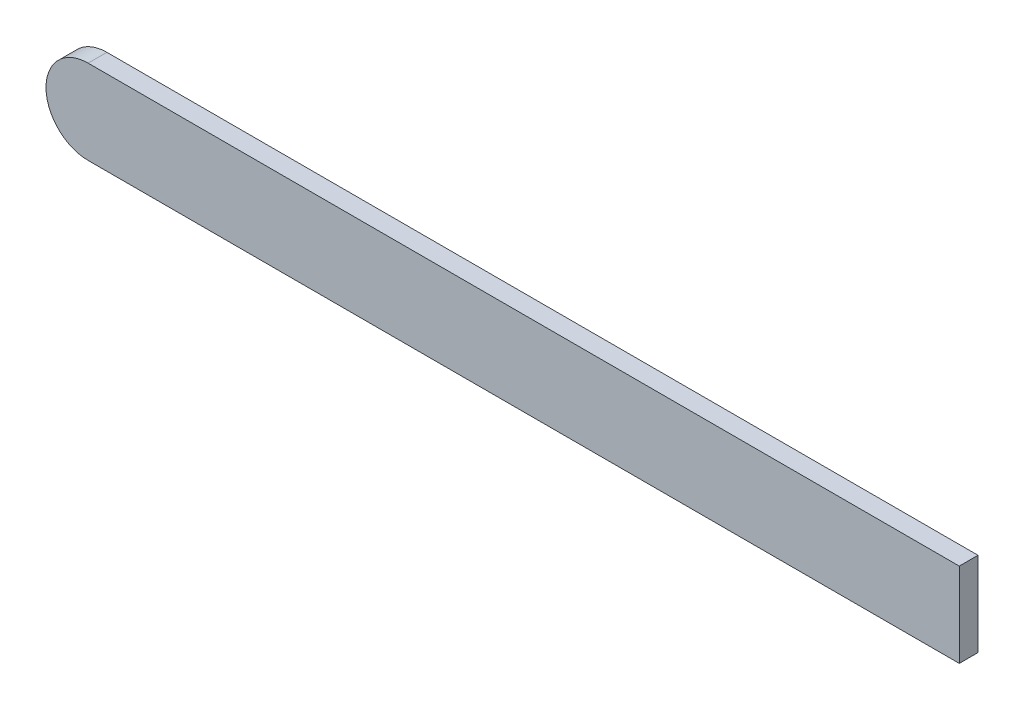
ISO-10303-21;
HEADER;
FILE_DESCRIPTION(('STEP AP214'),'2;1');
FILE_NAME('part.step','',(''),(''),'','','');
FILE_SCHEMA(('AUTOMOTIVE_DESIGN { 1 0 10303 214 1 1 1 1 }'));
ENDSEC;
DATA;
#1=APPLICATION_CONTEXT('core data for automotive mechanical design processes');
#2=APPLICATION_PROTOCOL_DEFINITION('international standard','automotive_design',2000,#1);
#3=PRODUCT_CONTEXT('',#1,'mechanical');
#4=PRODUCT('Part','Part','',(#3));
#5=PRODUCT_RELATED_PRODUCT_CATEGORY('part','',(#4));
#6=PRODUCT_DEFINITION_FORMATION('','',#4);
#7=PRODUCT_DEFINITION_CONTEXT('part definition',#1,'design');
#8=PRODUCT_DEFINITION('design','',#6,#7);
#9=PRODUCT_DEFINITION_SHAPE('','',#8);
#10=(LENGTH_UNIT() NAMED_UNIT(*) SI_UNIT(.MILLI.,.METRE.));
#11=(NAMED_UNIT(*) PLANE_ANGLE_UNIT() SI_UNIT($,.RADIAN.));
#12=(NAMED_UNIT(*) SI_UNIT($,.STERADIAN.) SOLID_ANGLE_UNIT());
#13=UNCERTAINTY_MEASURE_WITH_UNIT(LENGTH_MEASURE(1.E-05),#10,'distance_accuracy_value','');
#14=(GEOMETRIC_REPRESENTATION_CONTEXT(3) GLOBAL_UNCERTAINTY_ASSIGNED_CONTEXT((#13)) GLOBAL_UNIT_ASSIGNED_CONTEXT((#10,
#11,#12)) REPRESENTATION_CONTEXT('',''));
#15=CARTESIAN_POINT('',(0.,0.,0.));
#16=DIRECTION('',(0.,0.,1.));
#17=DIRECTION('',(1.,0.,0.));
#18=AXIS2_PLACEMENT_3D('',#15,#16,#17);
#19=CARTESIAN_POINT('',(-44.45,0.,2.11666666666582));
#20=DIRECTION('',(0.,0.,-1.));
#21=DIRECTION('',(-1.,0.,0.));
#22=AXIS2_PLACEMENT_3D('',#19,#20,#21);
#23=CYLINDRICAL_SURFACE('',#22,4.7625);
#24=CARTESIAN_POINT('',(-44.45,0.,0.));
#25=DIRECTION('',(0.,0.,1.));
#26=DIRECTION('',(1.,0.,0.));
#27=AXIS2_PLACEMENT_3D('',#24,#25,#26);
#28=CIRCLE('',#27,4.7625);
#29=CARTESIAN_POINT('',(-44.4500000000001,4.7625,0.));
#30=VERTEX_POINT('',#29);
#31=CARTESIAN_POINT('',(-44.4500000000001,-4.7625,0.));
#32=VERTEX_POINT('',#31);
#33=EDGE_CURVE('E109',#30,#32,#28,.T.);
#34=ORIENTED_EDGE('',*,*,#33,.T.);
#35=DIRECTION('',(0.,0.,-1.));
#36=VECTOR('',#35,1.);
#37=CARTESIAN_POINT('',(-44.4500000000001,-4.7625,2.11666666666582));
#38=LINE('',#37,#36);
#39=CARTESIAN_POINT('',(-44.4500000000001,-4.7625,2.11666666666582));
#40=VERTEX_POINT('',#39);
#41=EDGE_CURVE('E13',#40,#32,#38,.T.);
#42=ORIENTED_EDGE('',*,*,#41,.F.);
#43=CARTESIAN_POINT('',(-44.45,0.,2.11666666666582));
#44=DIRECTION('',(0.,0.,1.));
#45=DIRECTION('',(1.,0.,0.));
#46=AXIS2_PLACEMENT_3D('',#43,#44,#45);
#47=CIRCLE('',#46,4.7625);
#48=CARTESIAN_POINT('',(-44.4500000000001,4.76250000000001,2.11666666666585));
#49=VERTEX_POINT('',#48);
#50=EDGE_CURVE('E97',#49,#40,#47,.T.);
#51=ORIENTED_EDGE('',*,*,#50,.F.);
#52=DIRECTION('',(0.,0.,-1.));
#53=VECTOR('',#52,1.);
#54=CARTESIAN_POINT('',(-44.4500000000001,4.76250000000001,2.11666666666585));
#55=LINE('',#54,#53);
#56=EDGE_CURVE('E105',#49,#30,#55,.T.);
#57=ORIENTED_EDGE('',*,*,#56,.T.);
#58=EDGE_LOOP('',(#34,#42,#51,#57));
#59=FACE_BOUND('',#58,.T.);
#60=ADVANCED_FACE('F46',(#59),#23,.T.);
#61=CARTESIAN_POINT('',(-44.4500000000001,-4.7625,2.11666666666582));
#62=DIRECTION('',(0.,1.,0.));
#63=DIRECTION('',(0.,0.,1.));
#64=AXIS2_PLACEMENT_3D('',#61,#62,#63);
#65=PLANE('',#64);
#66=DIRECTION('',(1.,0.,0.));
#67=VECTOR('',#66,1.);
#68=CARTESIAN_POINT('',(-44.4500000000001,-4.7625,0.));
#69=LINE('',#68,#67);
#70=CARTESIAN_POINT('',(53.975,-4.76249999999999,0.));
#71=VERTEX_POINT('',#70);
#72=EDGE_CURVE('E101',#32,#71,#69,.T.);
#73=ORIENTED_EDGE('',*,*,#72,.T.);
#74=DIRECTION('',(0.,0.,-1.));
#75=VECTOR('',#74,1.);
#76=CARTESIAN_POINT('',(53.975,-4.7625,2.11666666666582));
#77=LINE('',#76,#75);
#78=CARTESIAN_POINT('',(53.975,-4.7625,2.11666666666582));
#79=VERTEX_POINT('',#78);
#80=EDGE_CURVE('E54',#79,#71,#77,.T.);
#81=ORIENTED_EDGE('',*,*,#80,.F.);
#82=DIRECTION('',(1.,0.,0.));
#83=VECTOR('',#82,1.);
#84=CARTESIAN_POINT('',(-44.4500000000001,-4.7625,2.11666666666582));
#85=LINE('',#84,#83);
#86=EDGE_CURVE('E92',#40,#79,#85,.T.);
#87=ORIENTED_EDGE('',*,*,#86,.F.);
#88=ORIENTED_EDGE('',*,*,#41,.T.);
#89=EDGE_LOOP('',(#73,#81,#87,#88));
#90=FACE_BOUND('',#89,.T.);
#91=ADVANCED_FACE('F100',(#90),#65,.F.);
#92=CARTESIAN_POINT('',(53.975,4.76250000000004,2.11666666666582));
#93=DIRECTION('',(-1.,0.,0.));
#94=DIRECTION('',(0.,0.,1.));
#95=AXIS2_PLACEMENT_3D('',#92,#93,#94);
#96=PLANE('',#95);
#97=DIRECTION('',(0.,1.,0.));
#98=VECTOR('',#97,1.);
#99=CARTESIAN_POINT('',(53.975,4.76250000000001,0.));
#100=LINE('',#99,#98);
#101=CARTESIAN_POINT('',(53.975,4.76250000000001,0.));
#102=VERTEX_POINT('',#101);
#103=EDGE_CURVE('E79',#71,#102,#100,.T.);
#104=ORIENTED_EDGE('',*,*,#103,.T.);
#105=DIRECTION('',(0.,0.,-1.));
#106=VECTOR('',#105,1.);
#107=CARTESIAN_POINT('',(53.975,4.76250000000004,2.11666666666582));
#108=LINE('',#107,#106);
#109=CARTESIAN_POINT('',(53.975,4.76250000000004,2.11666666666582));
#110=VERTEX_POINT('',#109);
#111=EDGE_CURVE('E102',#110,#102,#108,.T.);
#112=ORIENTED_EDGE('',*,*,#111,.F.);
#113=DIRECTION('',(0.,1.,0.));
#114=VECTOR('',#113,1.);
#115=CARTESIAN_POINT('',(53.975,4.76250000000004,2.11666666666582));
#116=LINE('',#115,#114);
#117=EDGE_CURVE('E95',#79,#110,#116,.T.);
#118=ORIENTED_EDGE('',*,*,#117,.F.);
#119=ORIENTED_EDGE('',*,*,#80,.T.);
#120=EDGE_LOOP('',(#104,#112,#118,#119));
#121=FACE_BOUND('',#120,.T.);
#122=ADVANCED_FACE('F103',(#121),#96,.F.);
#123=CARTESIAN_POINT('',(-44.4500000000001,4.76250000000001,2.11666666666585));
#124=DIRECTION('',(0.,-1.,0.));
#125=DIRECTION('',(0.,0.,-1.));
#126=AXIS2_PLACEMENT_3D('',#123,#124,#125);
#127=PLANE('',#126);
#128=DIRECTION('',(-1.,0.,0.));
#129=VECTOR('',#128,1.);
#130=CARTESIAN_POINT('',(-44.4500000000001,4.7625,0.));
#131=LINE('',#130,#129);
#132=EDGE_CURVE('E85',#102,#30,#131,.T.);
#133=ORIENTED_EDGE('',*,*,#132,.T.);
#134=ORIENTED_EDGE('',*,*,#56,.F.);
#135=DIRECTION('',(-1.,0.,0.));
#136=VECTOR('',#135,1.);
#137=CARTESIAN_POINT('',(-44.4500000000001,4.76250000000001,2.11666666666585));
#138=LINE('',#137,#136);
#139=EDGE_CURVE('E62',#110,#49,#138,.T.);
#140=ORIENTED_EDGE('',*,*,#139,.F.);
#141=ORIENTED_EDGE('',*,*,#111,.T.);
#142=EDGE_LOOP('',(#133,#134,#140,#141));
#143=FACE_BOUND('',#142,.T.);
#144=ADVANCED_FACE('F116',(#143),#127,.F.);
#145=CARTESIAN_POINT('',(-44.45,0.,2.11666666666582));
#146=DIRECTION('',(0.,0.,1.));
#147=DIRECTION('',(1.,0.,0.));
#148=AXIS2_PLACEMENT_3D('',#145,#146,#147);
#149=PLANE('',#148);
#150=ORIENTED_EDGE('',*,*,#50,.T.);
#151=ORIENTED_EDGE('',*,*,#86,.T.);
#152=ORIENTED_EDGE('',*,*,#117,.T.);
#153=ORIENTED_EDGE('',*,*,#139,.T.);
#154=EDGE_LOOP('',(#150,#151,#152,#153));
#155=FACE_BOUND('',#154,.T.);
#156=ADVANCED_FACE('F93',(#155),#149,.T.);
#157=CARTESIAN_POINT('',(-44.45,0.,0.));
#158=DIRECTION('',(0.,0.,1.));
#159=DIRECTION('',(1.,0.,0.));
#160=AXIS2_PLACEMENT_3D('',#157,#158,#159);
#161=PLANE('',#160);
#162=ORIENTED_EDGE('',*,*,#33,.F.);
#163=ORIENTED_EDGE('',*,*,#132,.F.);
#164=ORIENTED_EDGE('',*,*,#103,.F.);
#165=ORIENTED_EDGE('',*,*,#72,.F.);
#166=EDGE_LOOP('',(#162,#163,#164,#165));
#167=FACE_BOUND('',#166,.T.);
#168=ADVANCED_FACE('F119',(#167),#161,.F.);
#169=CLOSED_SHELL('',(#60,#91,#122,#144,#156,#168));
#170=MANIFOLD_SOLID_BREP('B2',#169);
#171=ADVANCED_BREP_SHAPE_REPRESENTATION('',(#18,#170),#14);
#172=SHAPE_DEFINITION_REPRESENTATION(#9,#171);
ENDSEC;
END-ISO-10303-21;
